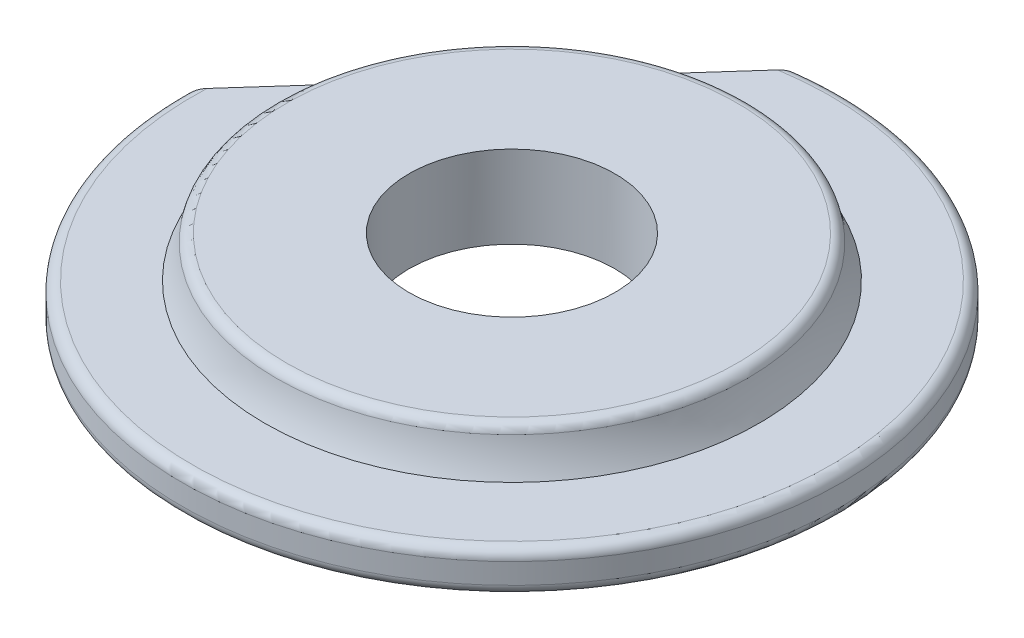
ISO-10303-21;
HEADER;
FILE_DESCRIPTION(('STEP AP214'),'2;1');
FILE_NAME('part.step','',(''),(''),'','','');
FILE_SCHEMA(('AUTOMOTIVE_DESIGN { 1 0 10303 214 1 1 1 1 }'));
ENDSEC;
DATA;
#1=APPLICATION_CONTEXT('core data for automotive mechanical design processes');
#2=APPLICATION_PROTOCOL_DEFINITION('international standard','automotive_design',2000,#1);
#3=PRODUCT_CONTEXT('',#1,'mechanical');
#4=PRODUCT('Part','Part','',(#3));
#5=PRODUCT_RELATED_PRODUCT_CATEGORY('part','',(#4));
#6=PRODUCT_DEFINITION_FORMATION('','',#4);
#7=PRODUCT_DEFINITION_CONTEXT('part definition',#1,'design');
#8=PRODUCT_DEFINITION('design','',#6,#7);
#9=PRODUCT_DEFINITION_SHAPE('','',#8);
#10=(LENGTH_UNIT() NAMED_UNIT(*) SI_UNIT(.MILLI.,.METRE.));
#11=(NAMED_UNIT(*) PLANE_ANGLE_UNIT() SI_UNIT($,.RADIAN.));
#12=(NAMED_UNIT(*) SI_UNIT($,.STERADIAN.) SOLID_ANGLE_UNIT());
#13=UNCERTAINTY_MEASURE_WITH_UNIT(LENGTH_MEASURE(1.E-05),#10,'distance_accuracy_value','');
#14=(GEOMETRIC_REPRESENTATION_CONTEXT(3) GLOBAL_UNCERTAINTY_ASSIGNED_CONTEXT((#13)) GLOBAL_UNIT_ASSIGNED_CONTEXT((#10,
#11,#12)) REPRESENTATION_CONTEXT('',''));
#15=CARTESIAN_POINT('',(0.,0.,0.));
#16=DIRECTION('',(0.,0.,1.));
#17=DIRECTION('',(1.,0.,0.));
#18=AXIS2_PLACEMENT_3D('',#15,#16,#17);
#19=CARTESIAN_POINT('',(82.1432955003034,11.2787722601828,1.9151952728527));
#20=DIRECTION('',(0.,1.,0.));
#21=DIRECTION('',(0.,0.,1.));
#22=AXIS2_PLACEMENT_3D('',#19,#20,#21);
#23=CYLINDRICAL_SURFACE('',#22,20.);
#24=DIRECTION('',(0.,1.,0.));
#25=VECTOR('',#24,1.);
#26=CARTESIAN_POINT('',(79.7727204322939,6.27852226018283,-17.9438171357977));
#27=LINE('',#26,#25);
#28=CARTESIAN_POINT('',(79.7727204322939,6.90377226018282,-17.9438171357977));
#29=VERTEX_POINT('',#28);
#30=CARTESIAN_POINT('',(79.7727204322939,8.15377226018282,-17.9438171357977));
#31=VERTEX_POINT('',#30);
#32=EDGE_CURVE('E89',#29,#31,#27,.T.);
#33=ORIENTED_EDGE('',*,*,#32,.T.);
#34=CARTESIAN_POINT('',(82.1432955003034,8.15377226018282,1.9151952728527));
#35=DIRECTION('',(0.,1.,0.));
#36=DIRECTION('',(0.,0.,1.));
#37=AXIS2_PLACEMENT_3D('',#34,#35,#36);
#38=CIRCLE('',#37,20.);
#39=CARTESIAN_POINT('',(62.1437205730642,8.15377226018282,1.78480075708274));
#40=VERTEX_POINT('',#39);
#41=EDGE_CURVE('E94',#31,#40,#38,.F.);
#42=ORIENTED_EDGE('',*,*,#41,.T.);
#43=DIRECTION('',(0.,1.,0.));
#44=VECTOR('',#43,1.);
#45=CARTESIAN_POINT('',(62.1437205730642,6.27852226018283,1.78480075708275));
#46=LINE('',#45,#44);
#47=CARTESIAN_POINT('',(62.1437205730642,6.90377226018282,1.78480075708274));
#48=VERTEX_POINT('',#47);
#49=EDGE_CURVE('E79',#48,#40,#46,.T.);
#50=ORIENTED_EDGE('',*,*,#49,.F.);
#51=CARTESIAN_POINT('',(82.1432955003034,6.90377226018282,1.9151952728527));
#52=DIRECTION('',(0.,-1.,0.));
#53=DIRECTION('',(0.,0.,-1.));
#54=AXIS2_PLACEMENT_3D('',#51,#52,#53);
#55=CIRCLE('',#54,20.);
#56=EDGE_CURVE('E98',#48,#29,#55,.F.);
#57=ORIENTED_EDGE('',*,*,#56,.T.);
#58=EDGE_LOOP('',(#33,#42,#50,#57));
#59=FACE_BOUND('',#58,.T.);
#60=ADVANCED_FACE('F39',(#59),#23,.T.);
#61=CARTESIAN_POINT('',(62.1432955003034,6.27877226018282,1.9151952728527));
#62=DIRECTION('',(0.,-1.,0.));
#63=DIRECTION('',(0.,0.,-1.));
#64=AXIS2_PLACEMENT_3D('',#61,#62,#63);
#65=PLANE('',#64);
#66=CARTESIAN_POINT('',(82.1432955003034,6.27877226018282,1.9151952728527));
#67=DIRECTION('',(0.,-1.,0.));
#68=DIRECTION('',(0.,0.,-1.));
#69=AXIS2_PLACEMENT_3D('',#66,#67,#68);
#70=CIRCLE('',#69,6.25);
#71=CARTESIAN_POINT('',(82.1432955003034,6.27877226018282,-4.33480472714729));
#72=VERTEX_POINT('',#71);
#73=EDGE_CURVE('E153',#72,#72,#70,.F.);
#74=ORIENTED_EDGE('',*,*,#73,.T.);
#75=EDGE_LOOP('',(#74));
#76=FACE_BOUND('',#75,.T.);
#77=DIRECTION('',(0.666313564147347,0.,-0.745671666508296));
#78=VECTOR('',#77,1.);
#79=CARTESIAN_POINT('',(62.1437205730642,6.27877226018282,1.78480075708275));
#80=LINE('',#79,#78);
#81=CARTESIAN_POINT('',(62.7869603723647,6.27877226018282,1.0649509462468));
#82=VERTEX_POINT('',#81);
#83=CARTESIAN_POINT('',(79.1294806329933,6.27877226018282,-17.2239673249618));
#84=VERTEX_POINT('',#83);
#85=EDGE_CURVE('E111',#82,#84,#80,.T.);
#86=ORIENTED_EDGE('',*,*,#85,.T.);
#87=CARTESIAN_POINT('',(82.1432955003034,6.27877226018282,1.9151952728527));
#88=DIRECTION('',(0.,-1.,0.));
#89=DIRECTION('',(0.,0.,-1.));
#90=AXIS2_PLACEMENT_3D('',#87,#88,#89);
#91=CIRCLE('',#90,19.375);
#92=EDGE_CURVE('E47',#84,#82,#91,.T.);
#93=ORIENTED_EDGE('',*,*,#92,.T.);
#94=EDGE_LOOP('',(#86,#93));
#95=FACE_BOUND('',#94,.T.);
#96=ADVANCED_FACE('F110',(#76,#95),#65,.T.);
#97=CARTESIAN_POINT('',(67.9440760193798,11.2787722601828,1.9151952728527));
#98=DIRECTION('',(0.,1.,0.));
#99=DIRECTION('',(0.,0.,1.));
#100=AXIS2_PLACEMENT_3D('',#97,#98,#99);
#101=PLANE('',#100);
#102=CARTESIAN_POINT('',(82.1432955003034,11.2787722601828,1.9151952728527));
#103=DIRECTION('',(0.,1.,0.));
#104=DIRECTION('',(0.,0.,1.));
#105=AXIS2_PLACEMENT_3D('',#102,#103,#104);
#106=CIRCLE('',#105,6.25);
#107=CARTESIAN_POINT('',(82.1432955003034,11.2787722601828,8.1651952728527));
#108=VERTEX_POINT('',#107);
#109=EDGE_CURVE('E152',#108,#108,#106,.T.);
#110=ORIENTED_EDGE('',*,*,#109,.F.);
#111=EDGE_LOOP('',(#110));
#112=FACE_BOUND('',#111,.T.);
#113=CARTESIAN_POINT('',(82.1432955003034,11.2787722601828,1.9151952728527));
#114=DIRECTION('',(0.,1.,0.));
#115=DIRECTION('',(0.,0.,1.));
#116=AXIS2_PLACEMENT_3D('',#113,#114,#115);
#117=CIRCLE('',#116,13.6727916926659);
#118=CARTESIAN_POINT('',(82.1432955003034,11.2787722601828,15.5879869655186));
#119=VERTEX_POINT('',#118);
#120=EDGE_CURVE('E103',#119,#119,#117,.T.);
#121=ORIENTED_EDGE('',*,*,#120,.T.);
#122=EDGE_LOOP('',(#121));
#123=FACE_BOUND('',#122,.T.);
#124=ADVANCED_FACE('F160',(#112,#123),#101,.T.);
#125=CARTESIAN_POINT('',(82.1432955003034,12.3195071188993,1.9151952728527));
#126=DIRECTION('',(0.,1.,0.));
#127=DIRECTION('',(0.,0.,1.));
#128=AXIS2_PLACEMENT_3D('',#125,#126,#127);
#129=TOROIDAL_SURFACE('',#128,21.7511787538993,7.62333377905169);
#130=CARTESIAN_POINT('',(82.1432955003034,10.7799897866052,1.9151952728527));
#131=DIRECTION('',(0.,1.,0.));
#132=DIRECTION('',(0.,0.,1.));
#133=AXIS2_PLACEMENT_3D('',#130,#131,#132);
#134=CIRCLE('',#133,14.2849143405265);
#135=CARTESIAN_POINT('',(82.1432955003034,10.7799897866052,16.2001096133792));
#136=VERTEX_POINT('',#135);
#137=EDGE_CURVE('E99',#136,#136,#134,.F.);
#138=ORIENTED_EDGE('',*,*,#137,.T.);
#139=EDGE_LOOP('',(#138));
#140=FACE_BOUND('',#139,.T.);
#141=CARTESIAN_POINT('',(82.1432955003034,8.77877226018282,1.9151952728527));
#142=DIRECTION('',(0.,1.,0.));
#143=DIRECTION('',(0.,0.,1.));
#144=AXIS2_PLACEMENT_3D('',#141,#142,#143);
#145=CIRCLE('',#144,15.);
#146=CARTESIAN_POINT('',(70.958220502679,8.77877226018282,-8.07950818935749));
#147=VERTEX_POINT('',#146);
#148=EDGE_CURVE('E116',#147,#147,#145,.T.);
#149=ORIENTED_EDGE('',*,*,#148,.T.);
#150=EDGE_LOOP('',(#149));
#151=FACE_BOUND('',#150,.T.);
#152=ADVANCED_FACE('F163',(#140,#151),#129,.F.);
#153=CARTESIAN_POINT('',(62.1432955003034,8.77877226018282,1.9151952728527));
#154=DIRECTION('',(0.,1.,0.));
#155=DIRECTION('',(0.,0.,1.));
#156=AXIS2_PLACEMENT_3D('',#153,#154,#155);
#157=PLANE('',#156);
#158=DIRECTION('',(0.666313564147347,0.,-0.745671666508296));
#159=VECTOR('',#158,1.);
#160=CARTESIAN_POINT('',(62.1437205730642,8.77877226018282,1.78480075708275));
#161=LINE('',#160,#159);
#162=CARTESIAN_POINT('',(62.7869603723647,8.77877226018282,1.0649509462468));
#163=VERTEX_POINT('',#162);
#164=EDGE_CURVE('E59',#163,#147,#161,.T.);
#165=ORIENTED_EDGE('',*,*,#164,.F.);
#166=CARTESIAN_POINT('',(82.1432955003034,8.77877226018282,1.9151952728527));
#167=DIRECTION('',(0.,1.,0.));
#168=DIRECTION('',(0.,0.,1.));
#169=AXIS2_PLACEMENT_3D('',#166,#167,#168);
#170=CIRCLE('',#169,19.375);
#171=CARTESIAN_POINT('',(79.1294806329933,8.77877226018282,-17.2239673249618));
#172=VERTEX_POINT('',#171);
#173=EDGE_CURVE('E11',#163,#172,#170,.T.);
#174=ORIENTED_EDGE('',*,*,#173,.T.);
#175=EDGE_CURVE('E54',#147,#172,#161,.T.);
#176=ORIENTED_EDGE('',*,*,#175,.F.);
#177=ORIENTED_EDGE('',*,*,#148,.F.);
#178=EDGE_LOOP('',(#165,#174,#176,#177));
#179=FACE_BOUND('',#178,.T.);
#180=ADVANCED_FACE('F170',(#179),#157,.T.);
#181=CARTESIAN_POINT('',(82.1432955003034,10.6537722601828,1.9151952728527));
#182=DIRECTION('',(0.,-1.,0.));
#183=DIRECTION('',(0.,0.,-1.));
#184=AXIS2_PLACEMENT_3D('',#181,#182,#183);
#185=TOROIDAL_SURFACE('',#184,13.6727916926659,0.625);
#186=ORIENTED_EDGE('',*,*,#137,.F.);
#187=EDGE_LOOP('',(#186));
#188=FACE_BOUND('',#187,.T.);
#189=ORIENTED_EDGE('',*,*,#120,.F.);
#190=EDGE_LOOP('',(#189));
#191=FACE_BOUND('',#190,.T.);
#192=ADVANCED_FACE('F168',(#188,#191),#185,.T.);
#193=CARTESIAN_POINT('',(82.1432955003034,6.90377226018282,1.9151952728527));
#194=DIRECTION('',(0.,-1.,0.));
#195=DIRECTION('',(0.,0.,-1.));
#196=AXIS2_PLACEMENT_3D('',#193,#194,#195);
#197=TOROIDAL_SURFACE('',#196,19.375,0.625);
#198=CARTESIAN_POINT('',(62.1437205750789,6.90382226018282,1.78480075482805));
#199=CARTESIAN_POINT('',(62.1437174484639,6.89035620771674,1.78480425382365));
#200=CARTESIAN_POINT('',(62.1441572153403,6.87689889833571,1.78431211060875));
#201=CARTESIAN_POINT('',(62.1458994407501,6.85012284861118,1.78236238574245));
#202=CARTESIAN_POINT('',(62.1472011013827,6.83680399166699,1.78090569702202));
#203=CARTESIAN_POINT('',(62.1523291835563,6.79747816945741,1.77516685905424));
#204=CARTESIAN_POINT('',(62.1573797846697,6.77181287231885,1.76951473015914));
#205=CARTESIAN_POINT('',(62.1703169561682,6.7222934614096,1.75503673848946));
#206=CARTESIAN_POINT('',(62.1781941166918,6.6984336524252,1.7462214062929));
#207=CARTESIAN_POINT('',(62.1962872149491,6.65275265013595,1.72597341577351));
#208=CARTESIAN_POINT('',(62.2065091849841,6.63093692297635,1.7145340067008));
#209=CARTESIAN_POINT('',(62.2339066905695,6.58005247052124,1.68387345174996));
#210=CARTESIAN_POINT('',(62.2521211268876,6.55224662737071,1.66348967177812));
#211=CARTESIAN_POINT('',(62.2912390211523,6.50131120653895,1.61971282709687));
#212=CARTESIAN_POINT('',(62.3121478881071,6.47819128270022,1.59631370916515));
#213=CARTESIAN_POINT('',(62.3664264823493,6.42607147535208,1.53557052156983));
#214=CARTESIAN_POINT('',(62.4009077283682,6.39968713811802,1.49698255103215));
#215=CARTESIAN_POINT('',(62.4721409628894,6.35525586827846,1.41726542150892));
#216=CARTESIAN_POINT('',(62.5088966057164,6.33722276998212,1.37613217296775));
#217=CARTESIAN_POINT('',(62.5990934073444,6.30261281359167,1.2751929110308));
#218=CARTESIAN_POINT('',(62.6531622302762,6.2897061873505,1.21468447855831));
#219=CARTESIAN_POINT('',(62.7620134268495,6.27702067506975,1.09286907884612));
#220=CARTESIAN_POINT('',(62.8167971153355,6.2772709192681,1.03156064016369));
#221=CARTESIAN_POINT('',(62.926791224527,6.29064188591219,0.90846620667138));
#222=CARTESIAN_POINT('',(62.9819894680343,6.30401096682961,0.846693839367062));
#223=CARTESIAN_POINT('',(63.0629115559903,6.33453605079454,0.75613391168384));
#224=CARTESIAN_POINT('',(63.0895453315356,6.34643787062243,0.726328047200749));
#225=CARTESIAN_POINT('',(63.1419316850647,6.3739814874347,0.667702466632966));
#226=CARTESIAN_POINT('',(63.1676850217206,6.38961996669424,0.638881901518135));
#227=CARTESIAN_POINT('',(63.2176785416695,6.42482251523255,0.582934141573309));
#228=CARTESIAN_POINT('',(63.2419310277136,6.44434683307306,0.555793178731539));
#229=CARTESIAN_POINT('',(63.2885952077685,6.48789832161314,0.503571283845893));
#230=CARTESIAN_POINT('',(63.3110081285494,6.51192245580065,0.478488978923328));
#231=CARTESIAN_POINT('',(63.348769694838,6.55964878599834,0.436230001199532));
#232=CARTESIAN_POINT('',(63.3646297955948,6.58243107848606,0.418480958708608));
#233=CARTESIAN_POINT('',(63.3937957509454,6.63145067059002,0.385841331209193));
#234=CARTESIAN_POINT('',(63.4071059033669,6.65768202881185,0.370945936500658));
#235=CARTESIAN_POINT('',(63.4269657365775,6.70586661251187,0.348720792479055));
#236=CARTESIAN_POINT('',(63.4343685851473,6.72702405925141,0.340436262901709));
#237=CARTESIAN_POINT('',(63.4467827568457,6.77084259375552,0.326543560431296));
#238=CARTESIAN_POINT('',(63.4518004068012,6.79349951993633,0.320928307184771));
#239=CARTESIAN_POINT('',(63.4576449126953,6.83089643427634,0.314387719262756));
#240=CARTESIAN_POINT('',(63.4593410742607,6.84533777496466,0.31248954445561));
#241=CARTESIAN_POINT('',(63.4616202388234,6.87445557237574,0.309938930856888));
#242=CARTESIAN_POINT('',(63.4622002123439,6.88913256025466,0.309289882353612));
#243=CARTESIAN_POINT('',(63.4621929038003,6.90382226018282,0.309298061346442));
#244=B_SPLINE_CURVE_WITH_KNOTS('',3,(#198,#199,#200,#201,#202,#203,#204,#205,#206,#207,#208,
#209,#210,#211,#212,#213,#214,#215,#216,#217,#218,#219,#220,#221,#222,#223,#224,#225,#226,#227,
#228,#229,#230,#231,#232,#233,#234,#235,#236,#237,#238,#239,#240,#241,#242,#243),.UNSPECIFIED.,
.F.,.F.,(4,2,2,2,2,2,2,2,2,2,2,2,2,2,2,2,2,2,2,2,2,2,4),(0.,0.0403653506476052,
0.0806933850950661,0.160496503520401,0.240036378409685,0.319783220713376,0.436107935093127,
0.552669916532418,0.725967851358157,0.899551846266838,1.14475080501186,1.39049267433679,
1.64097834493061,1.76595199890698,1.89081510026967,2.0144610726113,2.13802390631763,
2.23656583949488,2.33494019443705,2.4063732154157,2.47761568552607,2.52151719230926,
2.5655376862727),.UNSPECIFIED.);
#245=EDGE_CURVE('E84',#48,#82,#244,.T.);
#246=ORIENTED_EDGE('',*,*,#245,.T.);
#247=ORIENTED_EDGE('',*,*,#92,.F.);
#248=CARTESIAN_POINT('',(78.4542481015577,6.90382226018282,-16.4683144400614));
#249=CARTESIAN_POINT('',(78.4542440851797,6.89090853602633,-16.4683099453318));
#250=CARTESIAN_POINT('',(78.4546906949808,6.87800439878751,-16.4688097464654));
#251=CARTESIAN_POINT('',(78.4564547913248,6.85234748501269,-16.4707839470993));
#252=CARTESIAN_POINT('',(78.457771134266,6.83959453207122,-16.4722570667946));
#253=CARTESIAN_POINT('',(78.4629355883218,6.80204041928348,-16.4780366085443));
#254=CARTESIAN_POINT('',(78.4680008658953,6.77759985801502,-16.4837051618695));
#255=CARTESIAN_POINT('',(78.4808560643623,6.7305873546229,-16.4980914175003));
#256=CARTESIAN_POINT('',(78.4886327559474,6.70800698602317,-16.5067943148841));
#257=CARTESIAN_POINT('',(78.5063650012222,6.66479530251439,-16.5266384747459));
#258=CARTESIAN_POINT('',(78.5163279017966,6.6441709037593,-16.5377879591242));
#259=CARTESIAN_POINT('',(78.5440015716226,6.59394572594955,-16.5687575695417));
#260=CARTESIAN_POINT('',(78.562913295513,6.56584151533967,-16.5899216842));
#261=CARTESIAN_POINT('',(78.6033789537611,6.5143499242329,-16.6352068118722));
#262=CARTESIAN_POINT('',(78.6249386155639,6.49097306835382,-16.6593342344715));
#263=CARTESIAN_POINT('',(78.6829447514703,6.43597353121615,-16.7242489148209));
#264=CARTESIAN_POINT('',(78.7207232765255,6.40752437534789,-16.7665268711044));
#265=CARTESIAN_POINT('',(78.7986973508035,6.3595789581403,-16.8537876759865));
#266=CARTESIAN_POINT('',(78.8388977590405,6.34010142203103,-16.8987759623089));
#267=CARTESIAN_POINT('',(78.9354865276434,6.30355852248304,-17.0068684759924));
#268=CARTESIAN_POINT('',(78.9924564554284,6.28993211746803,-17.0706235355891));
#269=CARTESIAN_POINT('',(79.107114217924,6.2767620702208,-17.1989370645919));
#270=CARTESIAN_POINT('',(79.1648022907876,6.27722323120148,-17.2634958005152));
#271=CARTESIAN_POINT('',(79.268191680474,6.2913248060012,-17.3791988908544));
#272=CARTESIAN_POINT('',(79.3140501742723,6.3023948135562,-17.4305191420605));
#273=CARTESIAN_POINT('',(79.404059392827,6.33507017765036,-17.531248479736));
#274=CARTESIAN_POINT('',(79.4482139457572,6.35665023061531,-17.5806618503156));
#275=CARTESIAN_POINT('',(79.5174986324369,6.40182026095823,-17.6581983594906));
#276=CARTESIAN_POINT('',(79.5436790588673,6.42178667183747,-17.6874968808725));
#277=CARTESIAN_POINT('',(79.5938779278459,6.4671726261785,-17.7436744469649));
#278=CARTESIAN_POINT('',(79.6178989143888,6.49258563037176,-17.7705563386604));
#279=CARTESIAN_POINT('',(79.6569627718681,6.54220845708739,-17.8142727107622));
#280=CARTESIAN_POINT('',(79.6727421137963,6.565105484623,-17.8319313760291));
#281=CARTESIAN_POINT('',(79.7017223128604,6.61434517582393,-17.8643631236245));
#282=CARTESIAN_POINT('',(79.7149266402494,6.64068312117358,-17.8791400895143));
#283=CARTESIAN_POINT('',(79.7354286264268,6.69065317900732,-17.9020838670722));
#284=CARTESIAN_POINT('',(79.7433850852303,6.71367404659851,-17.9109879419924));
#285=CARTESIAN_POINT('',(79.7566531427859,6.76135593036304,-17.9258362283266));
#286=CARTESIAN_POINT('',(79.7619706162456,6.78601316367909,-17.9317870141273));
#287=CARTESIAN_POINT('',(79.768062139029,6.82634873621501,-17.9386040387083));
#288=CARTESIAN_POINT('',(79.7698017522518,6.84170857165771,-17.9405508402755));
#289=CARTESIAN_POINT('',(79.7721349058239,6.87264886669148,-17.9431618729874));
#290=CARTESIAN_POINT('',(79.7727264796741,6.88822965887361,-17.9438239034224));
#291=CARTESIAN_POINT('',(79.7727204302791,6.90382226018282,-17.943817133543));
#292=B_SPLINE_CURVE_WITH_KNOTS('',3,(#248,#249,#250,#251,#252,#253,#254,#255,#256,#257,#258,
#259,#260,#261,#262,#263,#264,#265,#266,#267,#268,#269,#270,#271,#272,#273,#274,#275,#276,#277,
#278,#279,#280,#281,#282,#283,#284,#285,#286,#287,#288,#289,#290,#291),.UNSPECIFIED.,.F.,.F.,(4,
2,2,2,2,2,2,2,2,2,2,2,2,2,2,2,2,2,2,2,2,4),(0.,0.0387058738194171,0.0773609547614577,
0.153657416906404,0.229586711965054,0.305775189980386,0.424927080284436,0.54434138947744,
0.733595494874197,0.923242834195663,1.18169553587798,1.44023635904286,1.64869235948102,
1.85664895196268,1.98852664530184,2.12024688234748,2.21874900690118,2.31711745217275,
2.39461843682227,2.47194611203152,2.51859716561446,2.56532805841342),.UNSPECIFIED.);
#293=EDGE_CURVE('E115',#84,#29,#292,.T.);
#294=ORIENTED_EDGE('',*,*,#293,.T.);
#295=ORIENTED_EDGE('',*,*,#56,.F.);
#296=EDGE_LOOP('',(#246,#247,#294,#295));
#297=FACE_BOUND('',#296,.T.);
#298=ADVANCED_FACE('F114',(#297),#197,.T.);
#299=CARTESIAN_POINT('',(82.1432955003034,8.15377226018282,1.9151952728527));
#300=DIRECTION('',(0.,1.,0.));
#301=DIRECTION('',(0.,0.,1.));
#302=AXIS2_PLACEMENT_3D('',#299,#300,#301);
#303=TOROIDAL_SURFACE('',#302,19.375,0.625);
#304=CARTESIAN_POINT('',(63.4621929038003,8.15372226018282,0.309298061346439));
#305=CARTESIAN_POINT('',(63.4621969201783,8.16663598433931,0.309293566616872));
#306=CARTESIAN_POINT('',(63.4617503103772,8.17954012157814,0.309793367750418));
#307=CARTESIAN_POINT('',(63.4599862140332,8.20519703535296,0.311767568384295));
#308=CARTESIAN_POINT('',(63.4586698710921,8.21794998829443,0.313240688079666));
#309=CARTESIAN_POINT('',(63.4535054170363,8.25550410108217,0.319020229829367));
#310=CARTESIAN_POINT('',(63.4484401394627,8.27994466235063,0.324688783154489));
#311=CARTESIAN_POINT('',(63.4355849409957,8.32695716574274,0.339075038785345));
#312=CARTESIAN_POINT('',(63.4278082494107,8.34953753434249,0.347777936169091));
#313=CARTESIAN_POINT('',(63.4100760041358,8.39274921785127,0.367622096030938));
#314=CARTESIAN_POINT('',(63.4001131035614,8.41337361660634,0.378771580409271));
#315=CARTESIAN_POINT('',(63.3724394337355,8.4635987944161,0.409741190826761));
#316=CARTESIAN_POINT('',(63.353527709845,8.49170300502598,0.430905305484993));
#317=CARTESIAN_POINT('',(63.313062051597,8.54319459613276,0.476190433157222));
#318=CARTESIAN_POINT('',(63.2915023897942,8.56657145201183,0.500317855756564));
#319=CARTESIAN_POINT('',(63.2334962538877,8.6215709891495,0.565232536105955));
#320=CARTESIAN_POINT('',(63.1957177288325,8.65002014501776,0.607510492389482));
#321=CARTESIAN_POINT('',(63.1177436545545,8.69796556222535,0.694771297271501));
#322=CARTESIAN_POINT('',(63.0775432463175,8.71744309833462,0.739759583593932));
#323=CARTESIAN_POINT('',(62.9809544777146,8.75398599788261,0.847852097277472));
#324=CARTESIAN_POINT('',(62.9239845499296,8.76761240289762,0.911607156874169));
#325=CARTESIAN_POINT('',(62.8093267874341,8.78078245014485,1.03992068587692));
#326=CARTESIAN_POINT('',(62.7516387145704,8.78032128916417,1.1044794218002));
#327=CARTESIAN_POINT('',(62.648249324884,8.76621971436444,1.22018251213941));
#328=CARTESIAN_POINT('',(62.6023908310857,8.75514970680945,1.27150276334556));
#329=CARTESIAN_POINT('',(62.512381612531,8.72247434271529,1.37223210102108));
#330=CARTESIAN_POINT('',(62.4682270596008,8.70089428975034,1.42164547160067));
#331=CARTESIAN_POINT('',(62.3989423729211,8.65572425940741,1.49918198077567));
#332=CARTESIAN_POINT('',(62.3727619464908,8.63575784852818,1.52848050215757));
#333=CARTESIAN_POINT('',(62.3225630775121,8.59037189418714,1.58465806824993));
#334=CARTESIAN_POINT('',(62.2985420909692,8.56495888999388,1.61153995994545));
#335=CARTESIAN_POINT('',(62.25947823349,8.51533606327825,1.65525633204728));
#336=CARTESIAN_POINT('',(62.2436988915617,8.49243903574264,1.67291499731414));
#337=CARTESIAN_POINT('',(62.2147186924977,8.44319934454171,1.70534674490953));
#338=CARTESIAN_POINT('',(62.2015143651086,8.41686139919206,1.72012371079938));
#339=CARTESIAN_POINT('',(62.1810123789313,8.36689134135833,1.74306748835722));
#340=CARTESIAN_POINT('',(62.1730559201278,8.34387047376714,1.75197156327741));
#341=CARTESIAN_POINT('',(62.1597878625721,8.29618859000261,1.76681984961166));
#342=CARTESIAN_POINT('',(62.1544703891124,8.27153135668655,1.77277063541235));
#343=CARTESIAN_POINT('',(62.1483788663291,8.23119578415063,1.77958765999328));
#344=CARTESIAN_POINT('',(62.1466392531063,8.21583594870793,1.7815344615605));
#345=CARTESIAN_POINT('',(62.1443060995341,8.18489565367416,1.78414549427241));
#346=CARTESIAN_POINT('',(62.1437145256839,8.16931486149203,1.78480752470745));
#347=CARTESIAN_POINT('',(62.1437205750789,8.15372226018282,1.78480075482805));
#348=B_SPLINE_CURVE_WITH_KNOTS('',3,(#304,#305,#306,#307,#308,#309,#310,#311,#312,#313,#314,
#315,#316,#317,#318,#319,#320,#321,#322,#323,#324,#325,#326,#327,#328,#329,#330,#331,#332,#333,
#334,#335,#336,#337,#338,#339,#340,#341,#342,#343,#344,#345,#346,#347),.UNSPECIFIED.,.F.,.F.,(4,
2,2,2,2,2,2,2,2,2,2,2,2,2,2,2,2,2,2,2,2,4),(0.,0.0387058738194172,0.0773609547614557,
0.153657416906405,0.229586711965056,0.305775189980389,0.424927080284442,0.544341389477447,
0.733595494874211,0.923242834195678,1.18169553587798,1.44023635904286,1.64869235948104,
1.85664895196269,1.98852664530183,2.12024688234749,2.21874900690119,2.31711745217275,
2.39461843682227,2.47194611203152,2.51859716561446,2.56532805841342),.UNSPECIFIED.);
#349=EDGE_CURVE('E82',#163,#40,#348,.T.);
#350=ORIENTED_EDGE('',*,*,#349,.T.);
#351=ORIENTED_EDGE('',*,*,#41,.F.);
#352=CARTESIAN_POINT('',(79.7727204302791,8.15372226018282,-17.943817133543));
#353=CARTESIAN_POINT('',(79.7727235568941,8.1671883126489,-17.9438206325386));
#354=CARTESIAN_POINT('',(79.7722837900177,8.18064562202994,-17.9433284893237));
#355=CARTESIAN_POINT('',(79.7705415646079,8.20742167175447,-17.9413787644574));
#356=CARTESIAN_POINT('',(79.7692399039753,8.22074052869866,-17.939922075737));
#357=CARTESIAN_POINT('',(79.7641118218017,8.26006635090824,-17.9341832377692));
#358=CARTESIAN_POINT('',(79.7590612206883,8.2857316480468,-17.9285311088741));
#359=CARTESIAN_POINT('',(79.7461240491899,8.33525105895604,-17.9140531172044));
#360=CARTESIAN_POINT('',(79.7382468886662,8.35911086794044,-17.9052377850079));
#361=CARTESIAN_POINT('',(79.7201537904089,8.4047918702297,-17.8849897944885));
#362=CARTESIAN_POINT('',(79.709931820374,8.42660759738929,-17.8735503854158));
#363=CARTESIAN_POINT('',(79.6825343147886,8.4774920498444,-17.8428898304649));
#364=CARTESIAN_POINT('',(79.6643198784705,8.50529789299494,-17.8225060504931));
#365=CARTESIAN_POINT('',(79.6252019842057,8.5562333138267,-17.7787292058118));
#366=CARTESIAN_POINT('',(79.6042931172509,8.57935323766543,-17.7553300878801));
#367=CARTESIAN_POINT('',(79.5500145230087,8.63147304501356,-17.6945869002848));
#368=CARTESIAN_POINT('',(79.5155332769899,8.65785738224763,-17.6559989297471));
#369=CARTESIAN_POINT('',(79.4443000424686,8.70228865208719,-17.5762818002239));
#370=CARTESIAN_POINT('',(79.4075443996416,8.72032175038352,-17.5351485516827));
#371=CARTESIAN_POINT('',(79.3173475980137,8.75493170677397,-17.4342092897458));
#372=CARTESIAN_POINT('',(79.2632787750818,8.76783833301514,-17.3737008572733));
#373=CARTESIAN_POINT('',(79.1544275785085,8.7805238452959,-17.2518854575611));
#374=CARTESIAN_POINT('',(79.0996438900225,8.78027360109755,-17.1905770188787));
#375=CARTESIAN_POINT('',(78.989649780831,8.76690263445346,-17.0674825853863));
#376=CARTESIAN_POINT('',(78.9344515373238,8.75353355353604,-17.005710218082));
#377=CARTESIAN_POINT('',(78.8535294493677,8.72300846957111,-16.9151502903988));
#378=CARTESIAN_POINT('',(78.8268956738224,8.71110664974321,-16.8853444259157));
#379=CARTESIAN_POINT('',(78.7745093202934,8.68356303293094,-16.8267188453479));
#380=CARTESIAN_POINT('',(78.7487559836374,8.6679245536714,-16.7978982802331));
#381=CARTESIAN_POINT('',(78.6987624636885,8.6327220051331,-16.7419505202883));
#382=CARTESIAN_POINT('',(78.6745099776444,8.61319768729259,-16.7148095574465));
#383=CARTESIAN_POINT('',(78.6278457975895,8.5696461987525,-16.6625876625609));
#384=CARTESIAN_POINT('',(78.6054328768086,8.54562206456499,-16.6375053576383));
#385=CARTESIAN_POINT('',(78.5676713105201,8.49789573436731,-16.5952463799145));
#386=CARTESIAN_POINT('',(78.5518112097632,8.47511344187958,-16.5774973374236));
#387=CARTESIAN_POINT('',(78.5226452544127,8.42609384977562,-16.5448577099242));
#388=CARTESIAN_POINT('',(78.5093351019911,8.39986249155379,-16.5299623152156));
#389=CARTESIAN_POINT('',(78.4894752687805,8.35167790785377,-16.507737171194));
#390=CARTESIAN_POINT('',(78.4820724202107,8.33052046111423,-16.4994526416167));
#391=CARTESIAN_POINT('',(78.4696582485123,8.28670192661011,-16.4855599391463));
#392=CARTESIAN_POINT('',(78.4646405985568,8.26404500042931,-16.4799446858997));
#393=CARTESIAN_POINT('',(78.4587960926627,8.2266480860893,-16.4734040979777));
#394=CARTESIAN_POINT('',(78.4570999310973,8.21220674540098,-16.4715059231706));
#395=CARTESIAN_POINT('',(78.4548207665346,8.1830889479899,-16.4689553095719));
#396=CARTESIAN_POINT('',(78.4542407930142,8.16841196011098,-16.4683062610686));
#397=CARTESIAN_POINT('',(78.4542481015577,8.15372226018282,-16.4683144400614));
#398=B_SPLINE_CURVE_WITH_KNOTS('',3,(#352,#353,#354,#355,#356,#357,#358,#359,#360,#361,#362,
#363,#364,#365,#366,#367,#368,#369,#370,#371,#372,#373,#374,#375,#376,#377,#378,#379,#380,#381,
#382,#383,#384,#385,#386,#387,#388,#389,#390,#391,#392,#393,#394,#395,#396,#397),.UNSPECIFIED.,
.F.,.F.,(4,2,2,2,2,2,2,2,2,2,2,2,2,2,2,2,2,2,2,2,2,2,4),(0.,0.0403653506476077,
0.0806933850950647,0.160496503520401,0.240036378409681,0.319783220713377,0.436107935093127,
0.552669916532421,0.725967851358152,0.899551846266847,1.14475080501187,1.3904926743368,
1.64097834493061,1.76595199890699,1.89081510026968,2.01446107261131,2.13802390631764,
2.2365658394949,2.33494019443706,2.40637321541571,2.47761568552608,2.52151719230927,
2.5655376862727),.UNSPECIFIED.);
#399=EDGE_CURVE('E95',#31,#172,#398,.T.);
#400=ORIENTED_EDGE('',*,*,#399,.T.);
#401=ORIENTED_EDGE('',*,*,#173,.F.);
#402=EDGE_LOOP('',(#350,#351,#400,#401));
#403=FACE_BOUND('',#402,.T.);
#404=ADVANCED_FACE('F41',(#403),#303,.T.);
#405=CARTESIAN_POINT('',(62.1437205730642,6.27852226018283,1.78480075708275));
#406=DIRECTION('',(0.745671666508296,0.,0.666313564147347));
#407=DIRECTION('',(0.666313564147347,0.,-0.745671666508296));
#408=AXIS2_PLACEMENT_3D('',#405,#406,#407);
#409=PLANE('',#408);
#410=ORIENTED_EDGE('',*,*,#49,.T.);
#411=ORIENTED_EDGE('',*,*,#349,.F.);
#412=ORIENTED_EDGE('',*,*,#164,.T.);
#413=ORIENTED_EDGE('',*,*,#175,.T.);
#414=ORIENTED_EDGE('',*,*,#399,.F.);
#415=ORIENTED_EDGE('',*,*,#32,.F.);
#416=ORIENTED_EDGE('',*,*,#293,.F.);
#417=ORIENTED_EDGE('',*,*,#85,.F.);
#418=ORIENTED_EDGE('',*,*,#245,.F.);
#419=EDGE_LOOP('',(#410,#411,#412,#413,#414,#415,#416,#417,#418));
#420=FACE_BOUND('',#419,.T.);
#421=ADVANCED_FACE('F81',(#420),#409,.F.);
#422=CARTESIAN_POINT('',(82.1432955003034,6.27827226018282,1.9151952728527));
#423=DIRECTION('',(0.,1.,0.));
#424=DIRECTION('',(0.,0.,1.));
#425=AXIS2_PLACEMENT_3D('',#422,#423,#424);
#426=CYLINDRICAL_SURFACE('',#425,6.25);
#427=ORIENTED_EDGE('',*,*,#73,.F.);
#428=EDGE_LOOP('',(#427));
#429=FACE_BOUND('',#428,.T.);
#430=ORIENTED_EDGE('',*,*,#109,.T.);
#431=EDGE_LOOP('',(#430));
#432=FACE_BOUND('',#431,.T.);
#433=ADVANCED_FACE('F133',(#429,#432),#426,.F.);
#434=CLOSED_SHELL('',(#60,#96,#124,#152,#180,#192,#298,#404,#421,#433));
#435=MANIFOLD_SOLID_BREP('B2',#434);
#436=ADVANCED_BREP_SHAPE_REPRESENTATION('',(#18,#435),#14);
#437=SHAPE_DEFINITION_REPRESENTATION(#9,#436);
ENDSEC;
END-ISO-10303-21;
